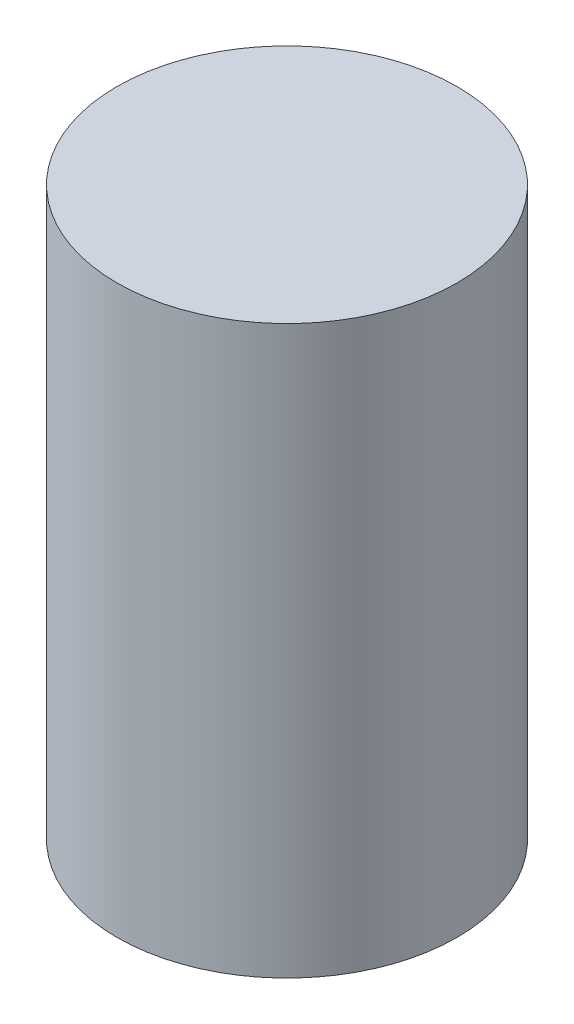
ISO-10303-21;
HEADER;
FILE_DESCRIPTION(('STEP AP214'),'2;1');
FILE_NAME('part.step','',(''),(''),'','','');
FILE_SCHEMA(('AUTOMOTIVE_DESIGN { 1 0 10303 214 1 1 1 1 }'));
ENDSEC;
DATA;
#1=APPLICATION_CONTEXT('core data for automotive mechanical design processes');
#2=APPLICATION_PROTOCOL_DEFINITION('international standard','automotive_design',2000,#1);
#3=PRODUCT_CONTEXT('',#1,'mechanical');
#4=PRODUCT('Part','Part','',(#3));
#5=PRODUCT_RELATED_PRODUCT_CATEGORY('part','',(#4));
#6=PRODUCT_DEFINITION_FORMATION('','',#4);
#7=PRODUCT_DEFINITION_CONTEXT('part definition',#1,'design');
#8=PRODUCT_DEFINITION('design','',#6,#7);
#9=PRODUCT_DEFINITION_SHAPE('','',#8);
#10=(LENGTH_UNIT() NAMED_UNIT(*) SI_UNIT(.MILLI.,.METRE.));
#11=(NAMED_UNIT(*) PLANE_ANGLE_UNIT() SI_UNIT($,.RADIAN.));
#12=(NAMED_UNIT(*) SI_UNIT($,.STERADIAN.) SOLID_ANGLE_UNIT());
#13=UNCERTAINTY_MEASURE_WITH_UNIT(LENGTH_MEASURE(1.E-05),#10,'distance_accuracy_value','');
#14=(GEOMETRIC_REPRESENTATION_CONTEXT(3) GLOBAL_UNCERTAINTY_ASSIGNED_CONTEXT((#13)) GLOBAL_UNIT_ASSIGNED_CONTEXT((#10,
#11,#12)) REPRESENTATION_CONTEXT('',''));
#15=CARTESIAN_POINT('',(0.,0.,0.));
#16=DIRECTION('',(0.,0.,1.));
#17=DIRECTION('',(1.,0.,0.));
#18=AXIS2_PLACEMENT_3D('',#15,#16,#17);
#19=CARTESIAN_POINT('',(0.,1000.,0.));
#20=DIRECTION('',(0.,-1.,0.));
#21=DIRECTION('',(0.,0.,-1.));
#22=AXIS2_PLACEMENT_3D('',#19,#20,#21);
#23=CYLINDRICAL_SURFACE('',#22,300.);
#24=CARTESIAN_POINT('',(0.,1000.,0.));
#25=DIRECTION('',(0.,1.,0.));
#26=DIRECTION('',(0.,0.,1.));
#27=AXIS2_PLACEMENT_3D('',#24,#25,#26);
#28=CIRCLE('',#27,300.);
#29=CARTESIAN_POINT('',(0.,1000.,300.));
#30=VERTEX_POINT('',#29);
#31=EDGE_CURVE('E10',#30,#30,#28,.T.);
#32=ORIENTED_EDGE('',*,*,#31,.F.);
#33=EDGE_LOOP('',(#32));
#34=FACE_BOUND('',#33,.T.);
#35=CARTESIAN_POINT('',(0.,0.,0.));
#36=DIRECTION('',(0.,1.,0.));
#37=DIRECTION('',(0.,0.,1.));
#38=AXIS2_PLACEMENT_3D('',#35,#36,#37);
#39=CIRCLE('',#38,300.);
#40=CARTESIAN_POINT('',(0.,0.,300.));
#41=VERTEX_POINT('',#40);
#42=EDGE_CURVE('E42',#41,#41,#39,.T.);
#43=ORIENTED_EDGE('',*,*,#42,.T.);
#44=EDGE_LOOP('',(#43));
#45=FACE_BOUND('',#44,.T.);
#46=ADVANCED_FACE('F39',(#34,#45),#23,.T.);
#47=CARTESIAN_POINT('',(0.,1000.,0.));
#48=DIRECTION('',(0.,1.,0.));
#49=DIRECTION('',(0.,0.,1.));
#50=AXIS2_PLACEMENT_3D('',#47,#48,#49);
#51=PLANE('',#50);
#52=ORIENTED_EDGE('',*,*,#31,.T.);
#53=EDGE_LOOP('',(#52));
#54=FACE_BOUND('',#53,.T.);
#55=ADVANCED_FACE('F54',(#54),#51,.T.);
#56=CARTESIAN_POINT('',(0.,0.,0.));
#57=DIRECTION('',(0.,1.,0.));
#58=DIRECTION('',(0.,0.,1.));
#59=AXIS2_PLACEMENT_3D('',#56,#57,#58);
#60=PLANE('',#59);
#61=ORIENTED_EDGE('',*,*,#42,.F.);
#62=EDGE_LOOP('',(#61));
#63=FACE_BOUND('',#62,.T.);
#64=ADVANCED_FACE('F52',(#63),#60,.F.);
#65=CLOSED_SHELL('',(#46,#55,#64));
#66=MANIFOLD_SOLID_BREP('B2',#65);
#67=ADVANCED_BREP_SHAPE_REPRESENTATION('',(#18,#66),#14);
#68=SHAPE_DEFINITION_REPRESENTATION(#9,#67);
ENDSEC;
END-ISO-10303-21;
